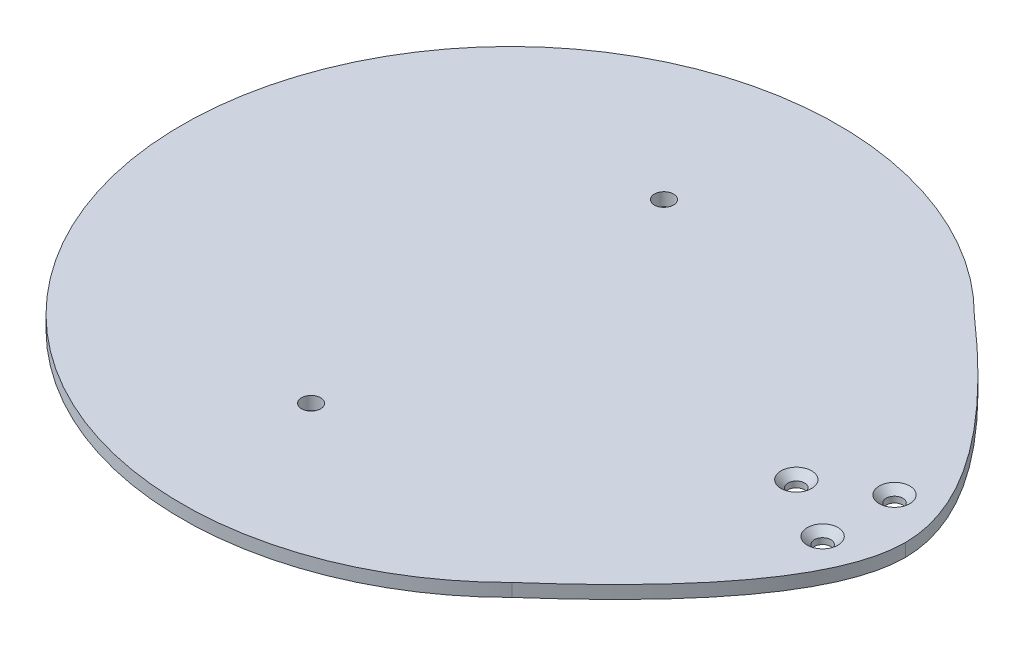
ISO-10303-21;
HEADER;
FILE_DESCRIPTION(('STEP AP214'),'2;1');
FILE_NAME('part.step','',(''),(''),'','','');
FILE_SCHEMA(('AUTOMOTIVE_DESIGN { 1 0 10303 214 1 1 1 1 }'));
ENDSEC;
DATA;
#1=APPLICATION_CONTEXT('core data for automotive mechanical design processes');
#2=APPLICATION_PROTOCOL_DEFINITION('international standard','automotive_design',2000,#1);
#3=PRODUCT_CONTEXT('',#1,'mechanical');
#4=PRODUCT('Part','Part','',(#3));
#5=PRODUCT_RELATED_PRODUCT_CATEGORY('part','',(#4));
#6=PRODUCT_DEFINITION_FORMATION('','',#4);
#7=PRODUCT_DEFINITION_CONTEXT('part definition',#1,'design');
#8=PRODUCT_DEFINITION('design','',#6,#7);
#9=PRODUCT_DEFINITION_SHAPE('','',#8);
#10=(LENGTH_UNIT() NAMED_UNIT(*) SI_UNIT(.MILLI.,.METRE.));
#11=(NAMED_UNIT(*) PLANE_ANGLE_UNIT() SI_UNIT($,.RADIAN.));
#12=(NAMED_UNIT(*) SI_UNIT($,.STERADIAN.) SOLID_ANGLE_UNIT());
#13=UNCERTAINTY_MEASURE_WITH_UNIT(LENGTH_MEASURE(1.E-05),#10,'distance_accuracy_value','');
#14=(GEOMETRIC_REPRESENTATION_CONTEXT(3) GLOBAL_UNCERTAINTY_ASSIGNED_CONTEXT((#13)) GLOBAL_UNIT_ASSIGNED_CONTEXT((#10,
#11,#12)) REPRESENTATION_CONTEXT('',''));
#15=CARTESIAN_POINT('',(0.,0.,0.));
#16=DIRECTION('',(0.,0.,1.));
#17=DIRECTION('',(1.,0.,0.));
#18=AXIS2_PLACEMENT_3D('',#15,#16,#17);
#19=CARTESIAN_POINT('',(60.1893638012401,2.5,0.00134865254178186));
#20=CARTESIAN_POINT('',(60.1893638012399,2.5,17.151737760422));
#21=CARTESIAN_POINT('',(28.9707527289508,2.5,44.5302618370659));
#22=B_SPLINE_CURVE_WITH_KNOTS('',2,(#19,#20,#21),.UNSPECIFIED.,.F.,.F.,(3,3),(0.,1.),.UNSPECIFIED.);
#23=DIRECTION('',(0.,-1.,0.));
#24=VECTOR('',#23,1.);
#25=SURFACE_OF_LINEAR_EXTRUSION('',#22,#24);
#26=CARTESIAN_POINT('',(60.1893638012401,0.,0.00134865254178186));
#27=CARTESIAN_POINT('',(60.1893638012399,0.,17.151737760422));
#28=CARTESIAN_POINT('',(28.9707527289508,0.,44.5302618370659));
#29=B_SPLINE_CURVE_WITH_KNOTS('',2,(#26,#27,#28),.UNSPECIFIED.,.F.,.F.,(3,3),(0.,1.),.UNSPECIFIED.);
#30=CARTESIAN_POINT('',(60.18936380124,0.,0.00134865254178186));
#31=VERTEX_POINT('',#30);
#32=CARTESIAN_POINT('',(28.9707527289508,0.,44.5302618370659));
#33=VERTEX_POINT('',#32);
#34=EDGE_CURVE('E113',#31,#33,#29,.T.);
#35=ORIENTED_EDGE('',*,*,#34,.F.);
#36=DIRECTION('',(0.,-1.,0.));
#37=VECTOR('',#36,1.);
#38=CARTESIAN_POINT('',(60.18936380124,2.5,0.00134865254178186));
#39=LINE('',#38,#37);
#40=CARTESIAN_POINT('',(60.18936380124,2.5,0.00134865254178186));
#41=VERTEX_POINT('',#40);
#42=EDGE_CURVE('E88',#41,#31,#39,.T.);
#43=ORIENTED_EDGE('',*,*,#42,.F.);
#44=CARTESIAN_POINT('',(28.9707527289508,2.5,44.5302618370659));
#45=VERTEX_POINT('',#44);
#46=EDGE_CURVE('E96',#41,#45,#22,.T.);
#47=ORIENTED_EDGE('',*,*,#46,.T.);
#48=DIRECTION('',(0.,-1.,0.));
#49=VECTOR('',#48,1.);
#50=CARTESIAN_POINT('',(28.9707527289508,2.5,44.5302618370659));
#51=LINE('',#50,#49);
#52=EDGE_CURVE('E84',#45,#33,#51,.T.);
#53=ORIENTED_EDGE('',*,*,#52,.T.);
#54=EDGE_LOOP('',(#35,#43,#47,#53));
#55=FACE_BOUND('',#54,.T.);
#56=ADVANCED_FACE('F42',(#55),#25,.T.);
#57=CARTESIAN_POINT('',(60.1893638012401,2.5,0.00134865254178186));
#58=CARTESIAN_POINT('',(60.18936380124,2.5,-17.1490404553384));
#59=CARTESIAN_POINT('',(28.970752728951,2.5,-44.5275645319826));
#60=B_SPLINE_CURVE_WITH_KNOTS('',2,(#57,#58,#59),.UNSPECIFIED.,.F.,.F.,(3,3),(0.,1.),.UNSPECIFIED.);
#61=DIRECTION('',(0.,-1.,0.));
#62=VECTOR('',#61,1.);
#63=SURFACE_OF_LINEAR_EXTRUSION('',#60,#62);
#64=CARTESIAN_POINT('',(60.1893638012401,0.,0.00134865254178186));
#65=CARTESIAN_POINT('',(60.18936380124,0.,-17.1490404553384));
#66=CARTESIAN_POINT('',(28.970752728951,0.,-44.5275645319826));
#67=B_SPLINE_CURVE_WITH_KNOTS('',2,(#64,#65,#66),.UNSPECIFIED.,.F.,.F.,(3,3),(0.,1.),.UNSPECIFIED.);
#68=CARTESIAN_POINT('',(28.970752728951,0.,-44.5275645319826));
#69=VERTEX_POINT('',#68);
#70=EDGE_CURVE('E102',#31,#69,#67,.T.);
#71=ORIENTED_EDGE('',*,*,#70,.T.);
#72=DIRECTION('',(0.,-1.,0.));
#73=VECTOR('',#72,1.);
#74=CARTESIAN_POINT('',(28.970752728951,2.5,-44.5275645319826));
#75=LINE('',#74,#73);
#76=CARTESIAN_POINT('',(28.970752728951,2.5,-44.5275645319826));
#77=VERTEX_POINT('',#76);
#78=EDGE_CURVE('E99',#77,#69,#75,.T.);
#79=ORIENTED_EDGE('',*,*,#78,.F.);
#80=EDGE_CURVE('E91',#41,#77,#60,.T.);
#81=ORIENTED_EDGE('',*,*,#80,.F.);
#82=ORIENTED_EDGE('',*,*,#42,.T.);
#83=EDGE_LOOP('',(#71,#79,#81,#82));
#84=FACE_BOUND('',#83,.T.);
#85=ADVANCED_FACE('F100',(#84),#63,.F.);
#86=CARTESIAN_POINT('',(-15.9501814073286,2.5,-0.000357392923572192));
#87=DIRECTION('',(0.,-1.,0.));
#88=DIRECTION('',(0.,0.,-1.));
#89=AXIS2_PLACEMENT_3D('',#86,#87,#88);
#90=CYLINDRICAL_SURFACE('',#89,63.2499999943134);
#91=CARTESIAN_POINT('',(-15.9501814073286,0.,-0.000357392923572192));
#92=DIRECTION('',(0.,1.,0.));
#93=DIRECTION('',(0.,0.,1.));
#94=AXIS2_PLACEMENT_3D('',#91,#92,#93);
#95=CIRCLE('',#94,63.2499999943134);
#96=CARTESIAN_POINT('',(28.9707527289507,0.,44.5268497461357));
#97=VERTEX_POINT('',#96);
#98=EDGE_CURVE('E77',#69,#97,#95,.T.);
#99=ORIENTED_EDGE('',*,*,#98,.T.);
#100=DIRECTION('',(0.,-1.,0.));
#101=VECTOR('',#100,1.);
#102=CARTESIAN_POINT('',(28.9707527289507,2.5,44.5268497461357));
#103=LINE('',#102,#101);
#104=CARTESIAN_POINT('',(28.9707527289507,2.5,44.5268497461357));
#105=VERTEX_POINT('',#104);
#106=EDGE_CURVE('E103',#105,#97,#103,.T.);
#107=ORIENTED_EDGE('',*,*,#106,.F.);
#108=CARTESIAN_POINT('',(-15.9501814073286,2.5,-0.000357392923572192));
#109=DIRECTION('',(0.,1.,0.));
#110=DIRECTION('',(0.,0.,1.));
#111=AXIS2_PLACEMENT_3D('',#108,#109,#110);
#112=CIRCLE('',#111,63.2499999943134);
#113=EDGE_CURVE('E95',#77,#105,#112,.T.);
#114=ORIENTED_EDGE('',*,*,#113,.F.);
#115=ORIENTED_EDGE('',*,*,#78,.T.);
#116=EDGE_LOOP('',(#99,#107,#114,#115));
#117=FACE_BOUND('',#116,.T.);
#118=ADVANCED_FACE('F105',(#117),#90,.T.);
#119=CARTESIAN_POINT('',(28.970752728498,2.5,-2.94577406656425E-10));
#120=DIRECTION('',(1.,0.,-1.01680964045734E-11));
#121=DIRECTION('',(-1.01680964045734E-11,0.,-1.));
#122=AXIS2_PLACEMENT_3D('',#119,#120,#121);
#123=PLANE('',#122);
#124=DIRECTION('',(1.01680964045734E-11,0.,1.));
#125=VECTOR('',#124,1.);
#126=CARTESIAN_POINT('',(28.970752728498,0.,-2.94577406656425E-10));
#127=LINE('',#126,#125);
#128=EDGE_CURVE('E129',#97,#33,#127,.T.);
#129=ORIENTED_EDGE('',*,*,#128,.T.);
#130=ORIENTED_EDGE('',*,*,#52,.F.);
#131=DIRECTION('',(1.01680964045734E-11,0.,1.));
#132=VECTOR('',#131,1.);
#133=CARTESIAN_POINT('',(28.970752728498,2.5,-2.94577406656425E-10));
#134=LINE('',#133,#132);
#135=EDGE_CURVE('E60',#105,#45,#134,.T.);
#136=ORIENTED_EDGE('',*,*,#135,.F.);
#137=ORIENTED_EDGE('',*,*,#106,.T.);
#138=EDGE_LOOP('',(#129,#130,#136,#137));
#139=FACE_BOUND('',#138,.T.);
#140=ADVANCED_FACE('F213',(#139),#123,.F.);
#141=CARTESIAN_POINT('',(0.,2.5,0.));
#142=DIRECTION('',(0.,1.,0.));
#143=DIRECTION('',(0.,0.,1.));
#144=AXIS2_PLACEMENT_3D('',#141,#142,#143);
#145=PLANE('',#144);
#146=CARTESIAN_POINT('',(-20.31063619876,2.5,34.0013486525418));
#147=DIRECTION('',(0.,1.,0.));
#148=DIRECTION('',(0.,0.,1.));
#149=AXIS2_PLACEMENT_3D('',#146,#147,#148);
#150=CIRCLE('',#149,1.85);
#151=CARTESIAN_POINT('',(-20.31063619876,2.5,35.8513486525418));
#152=VERTEX_POINT('',#151);
#153=EDGE_CURVE('E196',#152,#152,#150,.T.);
#154=ORIENTED_EDGE('',*,*,#153,.F.);
#155=EDGE_LOOP('',(#154));
#156=FACE_BOUND('',#155,.T.);
#157=CARTESIAN_POINT('',(-20.31063619876,2.5,-33.9986513474582));
#158=DIRECTION('',(0.,1.,0.));
#159=DIRECTION('',(0.,0.,1.));
#160=AXIS2_PLACEMENT_3D('',#157,#158,#159);
#161=CIRCLE('',#160,1.85);
#162=CARTESIAN_POINT('',(-20.31063619876,2.5,-32.1486513474582));
#163=VERTEX_POINT('',#162);
#164=EDGE_CURVE('E190',#163,#163,#161,.T.);
#165=ORIENTED_EDGE('',*,*,#164,.F.);
#166=EDGE_LOOP('',(#165));
#167=FACE_BOUND('',#166,.T.);
#168=CARTESIAN_POINT('',(51.1893638012404,2.5,6.92955188281712));
#169=DIRECTION('',(0.,1.,0.));
#170=DIRECTION('',(0.,0.,1.));
#171=AXIS2_PLACEMENT_3D('',#168,#169,#170);
#172=CIRCLE('',#171,2.94999999999998);
#173=CARTESIAN_POINT('',(51.1893638012404,2.5,9.8795518828171));
#174=VERTEX_POINT('',#173);
#175=EDGE_CURVE('E143',#174,#174,#172,.F.);
#176=ORIENTED_EDGE('',*,*,#175,.T.);
#177=EDGE_LOOP('',(#176));
#178=FACE_BOUND('',#177,.T.);
#179=CARTESIAN_POINT('',(39.1893638012404,2.5,0.00134865254194233));
#180=DIRECTION('',(0.,1.,0.));
#181=DIRECTION('',(0.,0.,1.));
#182=AXIS2_PLACEMENT_3D('',#179,#180,#181);
#183=CIRCLE('',#182,2.94999999999998);
#184=CARTESIAN_POINT('',(39.1893638012404,2.5,2.95134865254192));
#185=VERTEX_POINT('',#184);
#186=EDGE_CURVE('E140',#185,#185,#183,.F.);
#187=ORIENTED_EDGE('',*,*,#186,.T.);
#188=EDGE_LOOP('',(#187));
#189=FACE_BOUND('',#188,.T.);
#190=CARTESIAN_POINT('',(51.1893638012401,2.5,-6.92685457773371));
#191=DIRECTION('',(0.,1.,0.));
#192=DIRECTION('',(0.,0.,1.));
#193=AXIS2_PLACEMENT_3D('',#190,#191,#192);
#194=CIRCLE('',#193,2.94999999999998);
#195=CARTESIAN_POINT('',(51.1893638012401,2.5,-3.97685457773373));
#196=VERTEX_POINT('',#195);
#197=EDGE_CURVE('E137',#196,#196,#194,.F.);
#198=ORIENTED_EDGE('',*,*,#197,.T.);
#199=EDGE_LOOP('',(#198));
#200=FACE_BOUND('',#199,.T.);
#201=ORIENTED_EDGE('',*,*,#46,.F.);
#202=ORIENTED_EDGE('',*,*,#80,.T.);
#203=ORIENTED_EDGE('',*,*,#113,.T.);
#204=ORIENTED_EDGE('',*,*,#135,.T.);
#205=EDGE_LOOP('',(#201,#202,#203,#204));
#206=FACE_BOUND('',#205,.T.);
#207=ADVANCED_FACE('F93',(#156,#167,#178,#189,#200,#206),#145,.T.);
#208=CARTESIAN_POINT('',(0.,0.,0.));
#209=DIRECTION('',(0.,1.,0.));
#210=DIRECTION('',(0.,0.,1.));
#211=AXIS2_PLACEMENT_3D('',#208,#209,#210);
#212=PLANE('',#211);
#213=CARTESIAN_POINT('',(-20.31063619876,0.,34.0013486525418));
#214=DIRECTION('',(0.,1.,0.));
#215=DIRECTION('',(0.,0.,1.));
#216=AXIS2_PLACEMENT_3D('',#213,#214,#215);
#217=CIRCLE('',#216,1.85);
#218=CARTESIAN_POINT('',(-20.31063619876,0.,35.8513486525418));
#219=VERTEX_POINT('',#218);
#220=EDGE_CURVE('E185',#219,#219,#217,.T.);
#221=ORIENTED_EDGE('',*,*,#220,.T.);
#222=EDGE_LOOP('',(#221));
#223=FACE_BOUND('',#222,.T.);
#224=CARTESIAN_POINT('',(-20.31063619876,0.,-33.9986513474582));
#225=DIRECTION('',(0.,1.,0.));
#226=DIRECTION('',(0.,0.,1.));
#227=AXIS2_PLACEMENT_3D('',#224,#225,#226);
#228=CIRCLE('',#227,1.85);
#229=CARTESIAN_POINT('',(-20.31063619876,0.,-32.1486513474582));
#230=VERTEX_POINT('',#229);
#231=EDGE_CURVE('E193',#230,#230,#228,.T.);
#232=ORIENTED_EDGE('',*,*,#231,.T.);
#233=EDGE_LOOP('',(#232));
#234=FACE_BOUND('',#233,.T.);
#235=CARTESIAN_POINT('',(51.1893638012401,0.,-6.92685457773371));
#236=DIRECTION('',(0.,1.,0.));
#237=DIRECTION('',(0.,0.,1.));
#238=AXIS2_PLACEMENT_3D('',#235,#236,#237);
#239=CIRCLE('',#238,1.6);
#240=CARTESIAN_POINT('',(51.1893638012401,0.,-5.32685457773371));
#241=VERTEX_POINT('',#240);
#242=EDGE_CURVE('E118',#241,#241,#239,.T.);
#243=ORIENTED_EDGE('',*,*,#242,.T.);
#244=EDGE_LOOP('',(#243));
#245=FACE_BOUND('',#244,.T.);
#246=CARTESIAN_POINT('',(51.1893638012404,0.,6.92955188281712));
#247=DIRECTION('',(0.,1.,0.));
#248=DIRECTION('',(0.,0.,1.));
#249=AXIS2_PLACEMENT_3D('',#246,#247,#248);
#250=CIRCLE('',#249,1.60000000000001);
#251=CARTESIAN_POINT('',(51.1893638012404,0.,8.52955188281712));
#252=VERTEX_POINT('',#251);
#253=EDGE_CURVE('E184',#252,#252,#250,.T.);
#254=ORIENTED_EDGE('',*,*,#253,.T.);
#255=EDGE_LOOP('',(#254));
#256=FACE_BOUND('',#255,.T.);
#257=CARTESIAN_POINT('',(39.1893638012404,0.,0.00134865254194233));
#258=DIRECTION('',(0.,1.,0.));
#259=DIRECTION('',(0.,0.,1.));
#260=AXIS2_PLACEMENT_3D('',#257,#258,#259);
#261=CIRCLE('',#260,1.6);
#262=CARTESIAN_POINT('',(39.1893638012404,0.,1.60134865254194));
#263=VERTEX_POINT('',#262);
#264=EDGE_CURVE('E178',#263,#263,#261,.T.);
#265=ORIENTED_EDGE('',*,*,#264,.T.);
#266=EDGE_LOOP('',(#265));
#267=FACE_BOUND('',#266,.T.);
#268=ORIENTED_EDGE('',*,*,#34,.T.);
#269=ORIENTED_EDGE('',*,*,#128,.F.);
#270=ORIENTED_EDGE('',*,*,#98,.F.);
#271=ORIENTED_EDGE('',*,*,#70,.F.);
#272=EDGE_LOOP('',(#268,#269,#270,#271));
#273=FACE_BOUND('',#272,.T.);
#274=ADVANCED_FACE('F202',(#223,#234,#245,#256,#267,#273),#212,.F.);
#275=CARTESIAN_POINT('',(39.1893638012404,0.,0.00134865254194233));
#276=DIRECTION('',(0.,1.,0.));
#277=DIRECTION('',(0.,0.,1.));
#278=AXIS2_PLACEMENT_3D('',#275,#276,#277);
#279=CYLINDRICAL_SURFACE('',#278,1.6);
#280=CARTESIAN_POINT('',(39.1893638012404,1.15000000000004,0.00134865254194233));
#281=DIRECTION('',(0.,1.,0.));
#282=DIRECTION('',(0.,0.,1.));
#283=AXIS2_PLACEMENT_3D('',#280,#281,#282);
#284=CIRCLE('',#283,1.6);
#285=CARTESIAN_POINT('',(39.1893638012404,1.15000000000004,1.60134865254194));
#286=VERTEX_POINT('',#285);
#287=EDGE_CURVE('E52',#286,#286,#284,.T.);
#288=ORIENTED_EDGE('',*,*,#287,.T.);
#289=EDGE_LOOP('',(#288));
#290=FACE_BOUND('',#289,.T.);
#291=ORIENTED_EDGE('',*,*,#264,.F.);
#292=EDGE_LOOP('',(#291));
#293=FACE_BOUND('',#292,.T.);
#294=ADVANCED_FACE('F148',(#290,#293),#279,.F.);
#295=CARTESIAN_POINT('',(51.1893638012404,0.,6.92955188281712));
#296=DIRECTION('',(0.,1.,0.));
#297=DIRECTION('',(0.,0.,1.));
#298=AXIS2_PLACEMENT_3D('',#295,#296,#297);
#299=CYLINDRICAL_SURFACE('',#298,1.60000000000001);
#300=CARTESIAN_POINT('',(51.1893638012404,1.15000000000005,6.92955188281712));
#301=DIRECTION('',(0.,1.,0.));
#302=DIRECTION('',(0.,0.,1.));
#303=AXIS2_PLACEMENT_3D('',#300,#301,#302);
#304=CIRCLE('',#303,1.60000000000001);
#305=CARTESIAN_POINT('',(51.1893638012404,1.15000000000005,8.52955188281712));
#306=VERTEX_POINT('',#305);
#307=EDGE_CURVE('E134',#306,#306,#304,.T.);
#308=ORIENTED_EDGE('',*,*,#307,.T.);
#309=EDGE_LOOP('',(#308));
#310=FACE_BOUND('',#309,.T.);
#311=ORIENTED_EDGE('',*,*,#253,.F.);
#312=EDGE_LOOP('',(#311));
#313=FACE_BOUND('',#312,.T.);
#314=ADVANCED_FACE('F226',(#310,#313),#299,.F.);
#315=CARTESIAN_POINT('',(51.1893638012401,0.,-6.92685457773371));
#316=DIRECTION('',(0.,1.,0.));
#317=DIRECTION('',(0.,0.,1.));
#318=AXIS2_PLACEMENT_3D('',#315,#316,#317);
#319=CYLINDRICAL_SURFACE('',#318,1.6);
#320=CARTESIAN_POINT('',(51.1893638012401,1.15000000000004,-6.92685457773371));
#321=DIRECTION('',(0.,1.,0.));
#322=DIRECTION('',(0.,0.,1.));
#323=AXIS2_PLACEMENT_3D('',#320,#321,#322);
#324=CIRCLE('',#323,1.6);
#325=CARTESIAN_POINT('',(51.1893638012401,1.15000000000004,-5.32685457773371));
#326=VERTEX_POINT('',#325);
#327=EDGE_CURVE('E11',#326,#326,#324,.T.);
#328=ORIENTED_EDGE('',*,*,#327,.T.);
#329=EDGE_LOOP('',(#328));
#330=FACE_BOUND('',#329,.T.);
#331=ORIENTED_EDGE('',*,*,#242,.F.);
#332=EDGE_LOOP('',(#331));
#333=FACE_BOUND('',#332,.T.);
#334=ADVANCED_FACE('F161',(#330,#333),#319,.F.);
#335=CARTESIAN_POINT('',(51.1893638012404,1.15000000000005,6.92955188281712));
#336=DIRECTION('',(0.,1.,0.));
#337=DIRECTION('',(0.,0.,1.));
#338=AXIS2_PLACEMENT_3D('',#335,#336,#337);
#339=CONICAL_SURFACE('',#338,1.60000000000001,0.785398163397456);
#340=CARTESIAN_POINT('',(51.1893638012404,2.5,9.8795518828171));
#341=CARTESIAN_POINT('',(51.1893638012404,2.4859375,9.8654893828171));
#342=CARTESIAN_POINT('',(51.1893638012404,2.471875,9.8514268828171));
#343=CARTESIAN_POINT('',(51.1893638012404,2.44375,9.8233018828171));
#344=CARTESIAN_POINT('',(51.1893638012404,2.4296875,9.8092393828171));
#345=CARTESIAN_POINT('',(51.1893638012404,2.4015625,9.7811143828171));
#346=CARTESIAN_POINT('',(51.1893638012404,2.3875,9.7670518828171));
#347=CARTESIAN_POINT('',(51.1893638012404,2.359375,9.7389268828171));
#348=CARTESIAN_POINT('',(51.1893638012404,2.34531250000001,9.7248643828171));
#349=CARTESIAN_POINT('',(51.1893638012404,2.31718750000001,9.6967393828171));
#350=CARTESIAN_POINT('',(51.1893638012404,2.30312500000001,9.6826768828171));
#351=CARTESIAN_POINT('',(51.1893638012404,2.27500000000001,9.6545518828171));
#352=CARTESIAN_POINT('',(51.1893638012404,2.26093750000001,9.6404893828171));
#353=CARTESIAN_POINT('',(51.1893638012404,2.23281250000001,9.6123643828171));
#354=CARTESIAN_POINT('',(51.1893638012404,2.21875000000001,9.5983018828171));
#355=CARTESIAN_POINT('',(51.1893638012404,2.19062500000001,9.5701768828171));
#356=CARTESIAN_POINT('',(51.1893638012404,2.17656250000001,9.5561143828171));
#357=CARTESIAN_POINT('',(51.1893638012404,2.14843750000001,9.5279893828171));
#358=CARTESIAN_POINT('',(51.1893638012404,2.13437500000001,9.5139268828171));
#359=CARTESIAN_POINT('',(51.1893638012404,2.10625000000001,9.48580188281711));
#360=CARTESIAN_POINT('',(51.1893638012404,2.09218750000001,9.47173938281711));
#361=CARTESIAN_POINT('',(51.1893638012404,2.06406250000002,9.44361438281711));
#362=CARTESIAN_POINT('',(51.1893638012404,2.05000000000002,9.42955188281711));
#363=CARTESIAN_POINT('',(51.1893638012404,2.02187500000002,9.40142688281711));
#364=CARTESIAN_POINT('',(51.1893638012404,2.00781250000002,9.38736438281711));
#365=CARTESIAN_POINT('',(51.1893638012404,1.97968750000002,9.35923938281711));
#366=CARTESIAN_POINT('',(51.1893638012404,1.96562500000002,9.34517688281711));
#367=CARTESIAN_POINT('',(51.1893638012404,1.93750000000002,9.31705188281711));
#368=CARTESIAN_POINT('',(51.1893638012404,1.92343750000002,9.30298938281711));
#369=CARTESIAN_POINT('',(51.1893638012404,1.89531250000002,9.27486438281711));
#370=CARTESIAN_POINT('',(51.1893638012404,1.88125000000002,9.26080188281711));
#371=CARTESIAN_POINT('',(51.1893638012404,1.85312500000002,9.23267688281711));
#372=CARTESIAN_POINT('',(51.1893638012404,1.83906250000002,9.21861438281711));
#373=CARTESIAN_POINT('',(51.1893638012404,1.81093750000002,9.19048938281711));
#374=CARTESIAN_POINT('',(51.1893638012404,1.79687500000002,9.17642688281711));
#375=CARTESIAN_POINT('',(51.1893638012404,1.76875000000003,9.14830188281711));
#376=CARTESIAN_POINT('',(51.1893638012404,1.75468750000003,9.13423938281711));
#377=CARTESIAN_POINT('',(51.1893638012404,1.72656250000003,9.10611438281711));
#378=CARTESIAN_POINT('',(51.1893638012404,1.71250000000003,9.09205188281711));
#379=CARTESIAN_POINT('',(51.1893638012404,1.68437500000003,9.06392688281711));
#380=CARTESIAN_POINT('',(51.1893638012404,1.67031250000003,9.04986438281711));
#381=CARTESIAN_POINT('',(51.1893638012404,1.64218750000003,9.02173938281711));
#382=CARTESIAN_POINT('',(51.1893638012404,1.62812500000003,9.00767688281711));
#383=CARTESIAN_POINT('',(51.1893638012404,1.60000000000003,8.97955188281711));
#384=CARTESIAN_POINT('',(51.1893638012404,1.58593750000003,8.96548938281711));
#385=CARTESIAN_POINT('',(51.1893638012404,1.55781250000003,8.93736438281712));
#386=CARTESIAN_POINT('',(51.1893638012404,1.54375000000003,8.92330188281712));
#387=CARTESIAN_POINT('',(51.1893638012404,1.51562500000003,8.89517688281712));
#388=CARTESIAN_POINT('',(51.1893638012404,1.50156250000003,8.88111438281712));
#389=CARTESIAN_POINT('',(51.1893638012404,1.47343750000004,8.85298938281712));
#390=CARTESIAN_POINT('',(51.1893638012404,1.45937500000004,8.83892688281712));
#391=CARTESIAN_POINT('',(51.1893638012404,1.43125000000004,8.81080188281712));
#392=CARTESIAN_POINT('',(51.1893638012404,1.41718750000004,8.79673938281712));
#393=CARTESIAN_POINT('',(51.1893638012404,1.38906250000004,8.76861438281712));
#394=CARTESIAN_POINT('',(51.1893638012404,1.37500000000004,8.75455188281712));
#395=CARTESIAN_POINT('',(51.1893638012404,1.34687500000004,8.72642688281712));
#396=CARTESIAN_POINT('',(51.1893638012404,1.33281250000004,8.71236438281712));
#397=CARTESIAN_POINT('',(51.1893638012404,1.30468750000004,8.68423938281712));
#398=CARTESIAN_POINT('',(51.1893638012404,1.29062500000004,8.67017688281712));
#399=CARTESIAN_POINT('',(51.1893638012404,1.26250000000004,8.64205188281712));
#400=CARTESIAN_POINT('',(51.1893638012404,1.24843750000004,8.62798938281712));
#401=CARTESIAN_POINT('',(51.1893638012404,1.22031250000004,8.59986438281712));
#402=CARTESIAN_POINT('',(51.1893638012404,1.20625000000004,8.58580188281712));
#403=CARTESIAN_POINT('',(51.1893638012404,1.17812500000005,8.55767688281712));
#404=CARTESIAN_POINT('',(51.1893638012404,1.16406250000005,8.54361438281712));
#405=CARTESIAN_POINT('',(51.1893638012404,1.15000000000005,8.52955188281712));
#406=B_SPLINE_CURVE_WITH_KNOTS('',3,(#340,#341,#342,#343,#344,#345,#346,#347,#348,#349,#350,
#351,#352,#353,#354,#355,#356,#357,#358,#359,#360,#361,#362,#363,#364,#365,#366,#367,#368,#369,
#370,#371,#372,#373,#374,#375,#376,#377,#378,#379,#380,#381,#382,#383,#384,#385,#386,#387,#388,
#389,#390,#391,#392,#393,#394,#395,#396,#397,#398,#399,#400,#401,#402,#403,#404,#405),
.UNSPECIFIED.,.F.,.F.,(4,2,2,2,2,2,2,2,2,2,2,2,2,2,2,2,2,2,2,2,2,2,2,2,2,2,2,2,2,2,2,2,4),(0.,
0.059662134662613,0.119324269325226,0.178986403987839,0.238648538650453,0.298310673313067,
0.35797280797568,0.417634942638294,0.477297077300907,0.53695921196352,0.596621346626133,
0.656283481288746,0.71594561595136,0.775607750613974,0.835269885276587,0.8949320199392,
0.954594154601815,1.01425628926443,1.07391842392704,1.13358055858965,1.19324269325227,
1.25290482791488,1.31256696257749,1.37222909724011,1.43189123190272,1.49155336656533,
1.55121550122795,1.61087763589056,1.67053977055317,1.73020190521579,1.7898640398784,
1.84952617454101,1.90918830920363),.UNSPECIFIED.);
#407=EDGE_CURVE('BSEAM153',#174,#306,#406,.T.);
#408=ORIENTED_EDGE('',*,*,#175,.F.);
#409=ORIENTED_EDGE('',*,*,#307,.F.);
#410=ORIENTED_EDGE('',*,*,#407,.T.);
#411=ORIENTED_EDGE('',*,*,#407,.F.);
#412=EDGE_LOOP('',(#408,#410,#409,#411));
#413=FACE_BOUND('',#412,.T.);
#414=ADVANCED_FACE('F153',(#413),#339,.F.);
#415=CARTESIAN_POINT('',(39.1893638012404,1.15000000000004,0.00134865254194233));
#416=DIRECTION('',(0.,1.,0.));
#417=DIRECTION('',(0.,0.,1.));
#418=AXIS2_PLACEMENT_3D('',#415,#416,#417);
#419=CONICAL_SURFACE('',#418,1.6,0.785398163397456);
#420=ORIENTED_EDGE('',*,*,#186,.F.);
#421=EDGE_LOOP('',(#420));
#422=FACE_BOUND('',#421,.T.);
#423=ORIENTED_EDGE('',*,*,#287,.F.);
#424=EDGE_LOOP('',(#423));
#425=FACE_BOUND('',#424,.T.);
#426=ADVANCED_FACE('F151',(#422,#425),#419,.F.);
#427=CARTESIAN_POINT('',(51.1893638012401,1.15000000000004,-6.92685457773371));
#428=DIRECTION('',(0.,1.,0.));
#429=DIRECTION('',(0.,0.,1.));
#430=AXIS2_PLACEMENT_3D('',#427,#428,#429);
#431=CONICAL_SURFACE('',#430,1.6,0.785398163397456);
#432=ORIENTED_EDGE('',*,*,#197,.F.);
#433=EDGE_LOOP('',(#432));
#434=FACE_BOUND('',#433,.T.);
#435=ORIENTED_EDGE('',*,*,#327,.F.);
#436=EDGE_LOOP('',(#435));
#437=FACE_BOUND('',#436,.T.);
#438=ADVANCED_FACE('F45',(#434,#437),#431,.F.);
#439=CARTESIAN_POINT('',(-20.31063619876,0.,-33.9986513474582));
#440=DIRECTION('',(0.,1.,0.));
#441=DIRECTION('',(0.,0.,1.));
#442=AXIS2_PLACEMENT_3D('',#439,#440,#441);
#443=CYLINDRICAL_SURFACE('',#442,1.85);
#444=ORIENTED_EDGE('',*,*,#231,.F.);
#445=EDGE_LOOP('',(#444));
#446=FACE_BOUND('',#445,.T.);
#447=ORIENTED_EDGE('',*,*,#164,.T.);
#448=EDGE_LOOP('',(#447));
#449=FACE_BOUND('',#448,.T.);
#450=ADVANCED_FACE('F159',(#446,#449),#443,.F.);
#451=CARTESIAN_POINT('',(-20.31063619876,0.,34.0013486525418));
#452=DIRECTION('',(0.,1.,0.));
#453=DIRECTION('',(0.,0.,1.));
#454=AXIS2_PLACEMENT_3D('',#451,#452,#453);
#455=CYLINDRICAL_SURFACE('',#454,1.85);
#456=ORIENTED_EDGE('',*,*,#220,.F.);
#457=EDGE_LOOP('',(#456));
#458=FACE_BOUND('',#457,.T.);
#459=ORIENTED_EDGE('',*,*,#153,.T.);
#460=EDGE_LOOP('',(#459));
#461=FACE_BOUND('',#460,.T.);
#462=ADVANCED_FACE('F205',(#458,#461),#455,.F.);
#463=CLOSED_SHELL('',(#56,#85,#118,#140,#207,#274,#294,#314,#334,#414,#426,#438,#450,#462));
#464=MANIFOLD_SOLID_BREP('B2',#463);
#465=ADVANCED_BREP_SHAPE_REPRESENTATION('',(#18,#464),#14);
#466=SHAPE_DEFINITION_REPRESENTATION(#9,#465);
ENDSEC;
END-ISO-10303-21;
